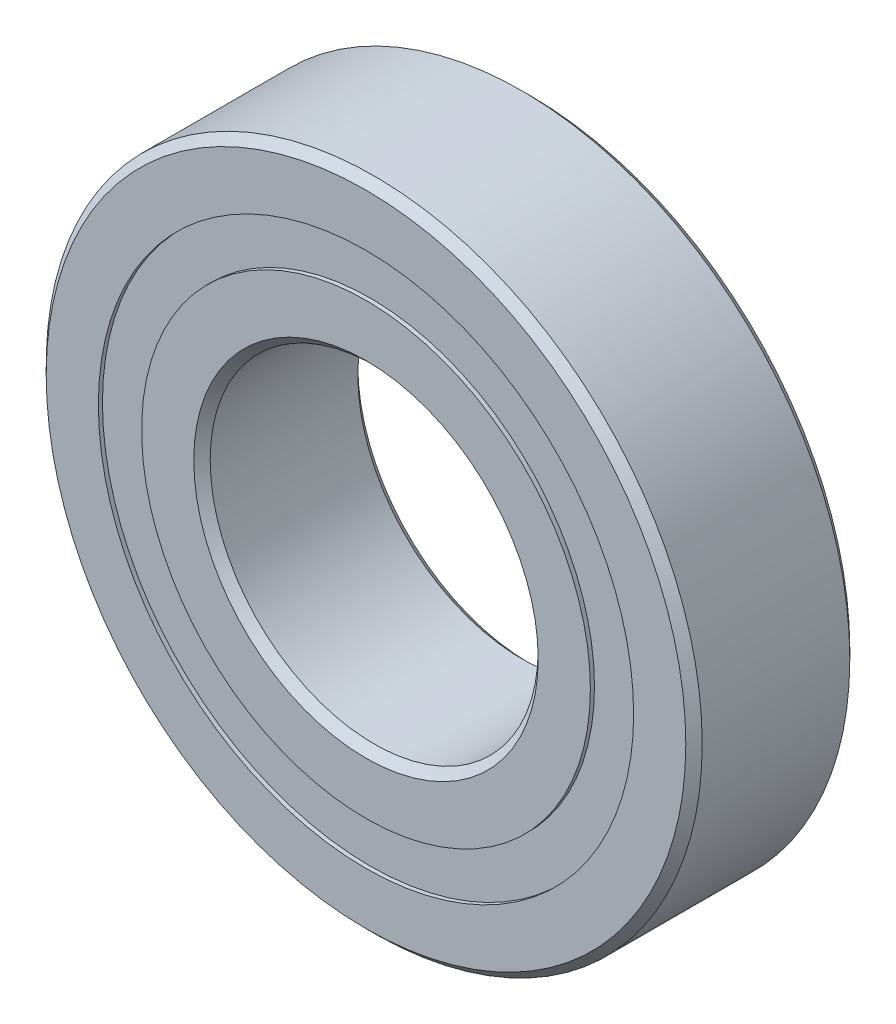
ISO-10303-21;
HEADER;
FILE_DESCRIPTION(('STEP AP214'),'2;1');
FILE_NAME('part.step','',(''),(''),'','','');
FILE_SCHEMA(('AUTOMOTIVE_DESIGN { 1 0 10303 214 1 1 1 1 }'));
ENDSEC;
DATA;
#1=APPLICATION_CONTEXT('core data for automotive mechanical design processes');
#2=APPLICATION_PROTOCOL_DEFINITION('international standard','automotive_design',2000,#1);
#3=PRODUCT_CONTEXT('',#1,'mechanical');
#4=PRODUCT('Part','Part','',(#3));
#5=PRODUCT_RELATED_PRODUCT_CATEGORY('part','',(#4));
#6=PRODUCT_DEFINITION_FORMATION('','',#4);
#7=PRODUCT_DEFINITION_CONTEXT('part definition',#1,'design');
#8=PRODUCT_DEFINITION('design','',#6,#7);
#9=PRODUCT_DEFINITION_SHAPE('','',#8);
#10=(LENGTH_UNIT() NAMED_UNIT(*) SI_UNIT(.MILLI.,.METRE.));
#11=(NAMED_UNIT(*) PLANE_ANGLE_UNIT() SI_UNIT($,.RADIAN.));
#12=(NAMED_UNIT(*) SI_UNIT($,.STERADIAN.) SOLID_ANGLE_UNIT());
#13=UNCERTAINTY_MEASURE_WITH_UNIT(LENGTH_MEASURE(1.E-05),#10,'distance_accuracy_value','');
#14=(GEOMETRIC_REPRESENTATION_CONTEXT(3) GLOBAL_UNCERTAINTY_ASSIGNED_CONTEXT((#13)) GLOBAL_UNIT_ASSIGNED_CONTEXT((#10,
#11,#12)) REPRESENTATION_CONTEXT('',''));
#15=CARTESIAN_POINT('',(0.,0.,0.));
#16=DIRECTION('',(0.,0.,1.));
#17=DIRECTION('',(1.,0.,0.));
#18=AXIS2_PLACEMENT_3D('',#15,#16,#17);
#19=CARTESIAN_POINT('',(0.,20.7247252747253,-6.0325));
#20=DIRECTION('',(0.,0.,1.));
#21=DIRECTION('',(1.,0.,0.));
#22=AXIS2_PLACEMENT_3D('',#19,#20,#21);
#23=PLANE('',#22);
#24=CARTESIAN_POINT('',(0.,0.,-6.0325));
#25=DIRECTION('',(0.,0.,1.));
#26=DIRECTION('',(1.,0.,0.));
#27=AXIS2_PLACEMENT_3D('',#24,#25,#26);
#28=CIRCLE('',#27,20.7247252747253);
#29=CARTESIAN_POINT('',(20.7247252747253,0.,-6.0325));
#30=VERTEX_POINT('',#29);
#31=EDGE_CURVE('E73',#30,#30,#28,.T.);
#32=ORIENTED_EDGE('',*,*,#31,.F.);
#33=EDGE_LOOP('',(#32));
#34=FACE_BOUND('',#33,.T.);
#35=CARTESIAN_POINT('',(0.,0.,-6.0325));
#36=DIRECTION('',(0.,0.,1.));
#37=DIRECTION('',(1.,0.,0.));
#38=AXIS2_PLACEMENT_3D('',#35,#36,#37);
#39=CIRCLE('',#38,17.3752747252747);
#40=CARTESIAN_POINT('',(17.3752747252747,0.,-6.0325));
#41=VERTEX_POINT('',#40);
#42=EDGE_CURVE('E11',#41,#41,#39,.T.);
#43=ORIENTED_EDGE('',*,*,#42,.T.);
#44=EDGE_LOOP('',(#43));
#45=FACE_BOUND('',#44,.T.);
#46=ADVANCED_FACE('F54',(#34,#45),#23,.F.);
#47=CARTESIAN_POINT('',(0.,0.,6.34999999999999));
#48=DIRECTION('',(0.,0.,1.));
#49=DIRECTION('',(1.,0.,0.));
#50=AXIS2_PLACEMENT_3D('',#47,#48,#49);
#51=CYLINDRICAL_SURFACE('',#50,17.3752747252747);
#52=ORIENTED_EDGE('',*,*,#42,.F.);
#53=EDGE_LOOP('',(#52));
#54=FACE_BOUND('',#53,.T.);
#55=CARTESIAN_POINT('',(0.,0.,-3.28171342706955));
#56=DIRECTION('',(0.,0.,1.));
#57=DIRECTION('',(1.,0.,0.));
#58=AXIS2_PLACEMENT_3D('',#55,#56,#57);
#59=CIRCLE('',#58,17.3752747252747);
#60=CARTESIAN_POINT('',(17.3752747252747,0.,-3.28171342706955));
#61=VERTEX_POINT('',#60);
#62=EDGE_CURVE('E61',#61,#61,#59,.T.);
#63=ORIENTED_EDGE('',*,*,#62,.T.);
#64=EDGE_LOOP('',(#63));
#65=FACE_BOUND('',#64,.T.);
#66=ADVANCED_FACE('F84',(#54,#65),#51,.F.);
#67=CARTESIAN_POINT('',(0.,20.7247252747253,-3.28171342706955));
#68=DIRECTION('',(0.,0.,-1.));
#69=DIRECTION('',(-1.,0.,0.));
#70=AXIS2_PLACEMENT_3D('',#67,#68,#69);
#71=PLANE('',#70);
#72=ORIENTED_EDGE('',*,*,#62,.F.);
#73=EDGE_LOOP('',(#72));
#74=FACE_BOUND('',#73,.T.);
#75=CARTESIAN_POINT('',(0.,0.,-3.28171342706955));
#76=DIRECTION('',(0.,0.,1.));
#77=DIRECTION('',(1.,0.,0.));
#78=AXIS2_PLACEMENT_3D('',#75,#76,#77);
#79=CIRCLE('',#78,20.7247252747253);
#80=CARTESIAN_POINT('',(20.7247252747253,0.,-3.28171342706955));
#81=VERTEX_POINT('',#80);
#82=EDGE_CURVE('E67',#81,#81,#79,.T.);
#83=ORIENTED_EDGE('',*,*,#82,.T.);
#84=EDGE_LOOP('',(#83));
#85=FACE_BOUND('',#84,.T.);
#86=ADVANCED_FACE('F88',(#74,#85),#71,.F.);
#87=CARTESIAN_POINT('',(0.,0.,6.34999999999999));
#88=DIRECTION('',(0.,0.,1.));
#89=DIRECTION('',(1.,0.,0.));
#90=AXIS2_PLACEMENT_3D('',#87,#88,#89);
#91=CYLINDRICAL_SURFACE('',#90,20.7247252747253);
#92=ORIENTED_EDGE('',*,*,#82,.F.);
#93=EDGE_LOOP('',(#92));
#94=FACE_BOUND('',#93,.T.);
#95=ORIENTED_EDGE('',*,*,#31,.T.);
#96=EDGE_LOOP('',(#95));
#97=FACE_BOUND('',#96,.T.);
#98=ADVANCED_FACE('F81',(#94,#97),#91,.T.);
#99=CLOSED_SHELL('',(#46,#66,#86,#98));
#100=MANIFOLD_SOLID_BREP('B2',#99);
#101=CARTESIAN_POINT('',(0.,20.7247252747253,6.0325));
#102=DIRECTION('',(0.,0.,-1.));
#103=DIRECTION('',(-1.,0.,0.));
#104=AXIS2_PLACEMENT_3D('',#101,#102,#103);
#105=PLANE('',#104);
#106=CARTESIAN_POINT('',(0.,0.,6.0325));
#107=DIRECTION('',(0.,0.,1.));
#108=DIRECTION('',(1.,0.,0.));
#109=AXIS2_PLACEMENT_3D('',#106,#107,#108);
#110=CIRCLE('',#109,17.3752747252747);
#111=CARTESIAN_POINT('',(17.3752747252747,0.,6.0325));
#112=VERTEX_POINT('',#111);
#113=EDGE_CURVE('E53',#112,#112,#110,.T.);
#114=ORIENTED_EDGE('',*,*,#113,.F.);
#115=EDGE_LOOP('',(#114));
#116=FACE_BOUND('',#115,.T.);
#117=CARTESIAN_POINT('',(0.,0.,6.0325));
#118=DIRECTION('',(0.,0.,1.));
#119=DIRECTION('',(1.,0.,0.));
#120=AXIS2_PLACEMENT_3D('',#117,#118,#119);
#121=CIRCLE('',#120,20.7247252747253);
#122=CARTESIAN_POINT('',(20.7247252747253,0.,6.0325));
#123=VERTEX_POINT('',#122);
#124=EDGE_CURVE('E165',#123,#123,#121,.T.);
#125=ORIENTED_EDGE('',*,*,#124,.T.);
#126=EDGE_LOOP('',(#125));
#127=FACE_BOUND('',#126,.T.);
#128=ADVANCED_FACE('F146',(#116,#127),#105,.F.);
#129=CARTESIAN_POINT('',(0.,0.,6.34999999999999));
#130=DIRECTION('',(0.,0.,1.));
#131=DIRECTION('',(1.,0.,0.));
#132=AXIS2_PLACEMENT_3D('',#129,#130,#131);
#133=CYLINDRICAL_SURFACE('',#132,17.3752747252747);
#134=CARTESIAN_POINT('',(0.,0.,3.28171342706955));
#135=DIRECTION('',(0.,0.,1.));
#136=DIRECTION('',(1.,0.,0.));
#137=AXIS2_PLACEMENT_3D('',#134,#135,#136);
#138=CIRCLE('',#137,17.3752747252747);
#139=CARTESIAN_POINT('',(17.3752747252747,0.,3.28171342706955));
#140=VERTEX_POINT('',#139);
#141=EDGE_CURVE('E153',#140,#140,#138,.T.);
#142=ORIENTED_EDGE('',*,*,#141,.F.);
#143=EDGE_LOOP('',(#142));
#144=FACE_BOUND('',#143,.T.);
#145=ORIENTED_EDGE('',*,*,#113,.T.);
#146=EDGE_LOOP('',(#145));
#147=FACE_BOUND('',#146,.T.);
#148=ADVANCED_FACE('F182',(#144,#147),#133,.F.);
#149=CARTESIAN_POINT('',(0.,20.7247252747253,3.28171342706955));
#150=DIRECTION('',(0.,0.,1.));
#151=DIRECTION('',(1.,0.,0.));
#152=AXIS2_PLACEMENT_3D('',#149,#150,#151);
#153=PLANE('',#152);
#154=CARTESIAN_POINT('',(0.,0.,3.28171342706955));
#155=DIRECTION('',(0.,0.,1.));
#156=DIRECTION('',(1.,0.,0.));
#157=AXIS2_PLACEMENT_3D('',#154,#155,#156);
#158=CIRCLE('',#157,20.7247252747253);
#159=CARTESIAN_POINT('',(20.7247252747253,0.,3.28171342706955));
#160=VERTEX_POINT('',#159);
#161=EDGE_CURVE('E159',#160,#160,#158,.T.);
#162=ORIENTED_EDGE('',*,*,#161,.F.);
#163=EDGE_LOOP('',(#162));
#164=FACE_BOUND('',#163,.T.);
#165=ORIENTED_EDGE('',*,*,#141,.T.);
#166=EDGE_LOOP('',(#165));
#167=FACE_BOUND('',#166,.T.);
#168=ADVANCED_FACE('F177',(#164,#167),#153,.F.);
#169=CARTESIAN_POINT('',(0.,0.,6.34999999999999));
#170=DIRECTION('',(0.,0.,1.));
#171=DIRECTION('',(1.,0.,0.));
#172=AXIS2_PLACEMENT_3D('',#169,#170,#171);
#173=CYLINDRICAL_SURFACE('',#172,20.7247252747253);
#174=ORIENTED_EDGE('',*,*,#124,.F.);
#175=EDGE_LOOP('',(#174));
#176=FACE_BOUND('',#175,.T.);
#177=ORIENTED_EDGE('',*,*,#161,.T.);
#178=EDGE_LOOP('',(#177));
#179=FACE_BOUND('',#178,.T.);
#180=ADVANCED_FACE('F174',(#176,#179),#173,.T.);
#181=CLOSED_SHELL('',(#128,#148,#168,#180));
#182=MANIFOLD_SOLID_BREP('B6',#181);
#183=CARTESIAN_POINT('',(-9.52499999999979,16.4977839420937,0.));
#184=DIRECTION('',(0.,0.,1.));
#185=DIRECTION('',(-0.499999999999987,0.866025403784445,0.));
#186=AXIS2_PLACEMENT_3D('',#183,#184,#185);
#187=SPHERICAL_SURFACE('',#186,3.28171342706955);
#188=CARTESIAN_POINT('',(-9.52499999999979,16.4977839420937,3.28171342706955));
#189=VERTEX_POINT('',#188);
#190=VERTEX_LOOP('',#189);
#191=FACE_BOUND('',#190,.T.);
#192=ADVANCED_FACE('F238',(#191),#187,.T.);
#193=CLOSED_SHELL('',(#192));
#194=MANIFOLD_SOLID_BREP('B48',#193);
#195=CARTESIAN_POINT('',(-16.4977839420934,9.52500000000017,0.));
#196=DIRECTION('',(0.,0.,1.));
#197=DIRECTION('',(-0.866025403784431,0.500000000000009,0.));
#198=AXIS2_PLACEMENT_3D('',#195,#196,#197);
#199=SPHERICAL_SURFACE('',#198,3.28171342706955);
#200=CARTESIAN_POINT('',(-16.4977839420934,9.52500000000017,3.28171342706955));
#201=VERTEX_POINT('',#200);
#202=VERTEX_LOOP('',#201);
#203=FACE_BOUND('',#202,.T.);
#204=ADVANCED_FACE('F263',(#203),#199,.T.);
#205=CLOSED_SHELL('',(#204));
#206=MANIFOLD_SOLID_BREP('B142',#205);
#207=CARTESIAN_POINT('',(-19.05,1.7206288477345E-13,0.));
#208=DIRECTION('',(0.,0.,1.));
#209=DIRECTION('',(-1.,0.,0.));
#210=AXIS2_PLACEMENT_3D('',#207,#208,#209);
#211=SPHERICAL_SURFACE('',#210,3.28171342706955);
#212=CARTESIAN_POINT('',(-19.05,1.7206288477345E-13,3.28171342706955));
#213=VERTEX_POINT('',#212);
#214=VERTEX_LOOP('',#213);
#215=FACE_BOUND('',#214,.T.);
#216=ADVANCED_FACE('F288',(#215),#211,.T.);
#217=CLOSED_SHELL('',(#216));
#218=MANIFOLD_SOLID_BREP('B234',#217);
#219=CARTESIAN_POINT('',(-16.4977839420936,-9.52499999999987,0.));
#220=DIRECTION('',(0.,0.,1.));
#221=DIRECTION('',(-0.866025403784443,-0.499999999999993,0.));
#222=AXIS2_PLACEMENT_3D('',#219,#220,#221);
#223=SPHERICAL_SURFACE('',#222,3.28171342706955);
#224=CARTESIAN_POINT('',(-16.4977839420936,-9.52499999999987,3.28171342706955));
#225=VERTEX_POINT('',#224);
#226=VERTEX_LOOP('',#225);
#227=FACE_BOUND('',#226,.T.);
#228=ADVANCED_FACE('F313',(#227),#223,.T.);
#229=CLOSED_SHELL('',(#228));
#230=MANIFOLD_SOLID_BREP('B259',#229);
#231=CARTESIAN_POINT('',(-9.52500000000013,-16.4977839420935,0.));
#232=DIRECTION('',(0.,0.,1.));
#233=DIRECTION('',(-0.500000000000009,-0.866025403784436,0.));
#234=AXIS2_PLACEMENT_3D('',#231,#232,#233);
#235=SPHERICAL_SURFACE('',#234,3.28171342706955);
#236=CARTESIAN_POINT('',(-9.52500000000013,-16.4977839420935,3.28171342706955));
#237=VERTEX_POINT('',#236);
#238=VERTEX_LOOP('',#237);
#239=FACE_BOUND('',#238,.T.);
#240=ADVANCED_FACE('F338',(#239),#235,.T.);
#241=CLOSED_SHELL('',(#240));
#242=MANIFOLD_SOLID_BREP('B284',#241);
#243=CARTESIAN_POINT('',(-1.56125112837913E-13,-19.05,0.));
#244=DIRECTION('',(0.,0.,1.));
#245=DIRECTION('',(0.,-1.,0.));
#246=AXIS2_PLACEMENT_3D('',#243,#244,#245);
#247=SPHERICAL_SURFACE('',#246,3.28171342706955);
#248=CARTESIAN_POINT('',(-1.56125112837913E-13,-19.05,3.28171342706955));
#249=VERTEX_POINT('',#248);
#250=VERTEX_LOOP('',#249);
#251=FACE_BOUND('',#250,.T.);
#252=ADVANCED_FACE('F363',(#251),#247,.T.);
#253=CLOSED_SHELL('',(#252));
#254=MANIFOLD_SOLID_BREP('B309',#253);
#255=CARTESIAN_POINT('',(9.5249999999999,-16.4977839420936,0.));
#256=DIRECTION('',(0.,0.,1.));
#257=DIRECTION('',(0.499999999999994,-0.866025403784442,0.));
#258=AXIS2_PLACEMENT_3D('',#255,#256,#257);
#259=SPHERICAL_SURFACE('',#258,3.28171342706955);
#260=CARTESIAN_POINT('',(9.5249999999999,-16.4977839420936,3.28171342706955));
#261=VERTEX_POINT('',#260);
#262=VERTEX_LOOP('',#261);
#263=FACE_BOUND('',#262,.T.);
#264=ADVANCED_FACE('F388',(#263),#259,.T.);
#265=CLOSED_SHELL('',(#264));
#266=MANIFOLD_SOLID_BREP('B334',#265);
#267=CARTESIAN_POINT('',(16.4977839420935,-9.52500000000005,0.));
#268=DIRECTION('',(0.,0.,1.));
#269=DIRECTION('',(0.866025403784435,-0.500000000000003,0.));
#270=AXIS2_PLACEMENT_3D('',#267,#268,#269);
#271=SPHERICAL_SURFACE('',#270,3.28171342706955);
#272=CARTESIAN_POINT('',(16.4977839420935,-9.52500000000005,3.28171342706955));
#273=VERTEX_POINT('',#272);
#274=VERTEX_LOOP('',#273);
#275=FACE_BOUND('',#274,.T.);
#276=ADVANCED_FACE('F413',(#275),#271,.T.);
#277=CLOSED_SHELL('',(#276));
#278=MANIFOLD_SOLID_BREP('B359',#277);
#279=CARTESIAN_POINT('',(19.05,0.,0.));
#280=DIRECTION('',(0.,0.,1.));
#281=DIRECTION('',(1.,0.,0.));
#282=AXIS2_PLACEMENT_3D('',#279,#280,#281);
#283=SPHERICAL_SURFACE('',#282,3.28171342706955);
#284=CARTESIAN_POINT('',(19.05,0.,3.28171342706955));
#285=VERTEX_POINT('',#284);
#286=VERTEX_LOOP('',#285);
#287=FACE_BOUND('',#286,.T.);
#288=ADVANCED_FACE('F438',(#287),#283,.T.);
#289=CLOSED_SHELL('',(#288));
#290=MANIFOLD_SOLID_BREP('B384',#289);
#291=CARTESIAN_POINT('',(16.4977839420936,9.52499999999998,0.));
#292=DIRECTION('',(0.,0.,1.));
#293=DIRECTION('',(0.86602540378444,0.499999999999999,0.));
#294=AXIS2_PLACEMENT_3D('',#291,#292,#293);
#295=SPHERICAL_SURFACE('',#294,3.28171342706955);
#296=CARTESIAN_POINT('',(16.4977839420936,9.52499999999998,3.28171342706955));
#297=VERTEX_POINT('',#296);
#298=VERTEX_LOOP('',#297);
#299=FACE_BOUND('',#298,.T.);
#300=ADVANCED_FACE('F463',(#299),#295,.T.);
#301=CLOSED_SHELL('',(#300));
#302=MANIFOLD_SOLID_BREP('B409',#301);
#303=CARTESIAN_POINT('',(9.52500000000002,16.4977839420936,0.));
#304=DIRECTION('',(0.,0.,1.));
#305=DIRECTION('',(0.500000000000002,0.866025403784439,0.));
#306=AXIS2_PLACEMENT_3D('',#303,#304,#305);
#307=SPHERICAL_SURFACE('',#306,3.28171342706955);
#308=CARTESIAN_POINT('',(9.52500000000002,16.4977839420936,3.28171342706955));
#309=VERTEX_POINT('',#308);
#310=VERTEX_LOOP('',#309);
#311=FACE_BOUND('',#310,.T.);
#312=ADVANCED_FACE('F488',(#311),#307,.T.);
#313=CLOSED_SHELL('',(#312));
#314=MANIFOLD_SOLID_BREP('B434',#313);
#315=CARTESIAN_POINT('',(0.,19.05,0.));
#316=DIRECTION('',(0.,0.,1.));
#317=DIRECTION('',(0.,1.,0.));
#318=AXIS2_PLACEMENT_3D('',#315,#316,#317);
#319=SPHERICAL_SURFACE('',#318,3.28171342706955);
#320=CARTESIAN_POINT('',(0.,19.05,3.28171342706955));
#321=VERTEX_POINT('',#320);
#322=VERTEX_LOOP('',#321);
#323=FACE_BOUND('',#322,.T.);
#324=ADVANCED_FACE('F515',(#323),#319,.T.);
#325=CLOSED_SHELL('',(#324));
#326=MANIFOLD_SOLID_BREP('B459',#325);
#327=CARTESIAN_POINT('',(0.,17.3752747252747,6.35000000000001));
#328=DIRECTION('',(0.,0.,-1.));
#329=DIRECTION('',(-1.,0.,0.));
#330=AXIS2_PLACEMENT_3D('',#327,#328,#329);
#331=PLANE('',#330);
#332=CARTESIAN_POINT('',(0.,0.,6.35000000000001));
#333=DIRECTION('',(0.,0.,1.));
#334=DIRECTION('',(1.,0.,0.));
#335=AXIS2_PLACEMENT_3D('',#332,#333,#334);
#336=CIRCLE('',#335,13.335);
#337=CARTESIAN_POINT('',(13.335,0.,6.35000000000001));
#338=VERTEX_POINT('',#337);
#339=EDGE_CURVE('E572',#338,#338,#336,.T.);
#340=ORIENTED_EDGE('',*,*,#339,.F.);
#341=EDGE_LOOP('',(#340));
#342=FACE_BOUND('',#341,.T.);
#343=CARTESIAN_POINT('',(0.,0.,6.35000000000001));
#344=DIRECTION('',(0.,0.,1.));
#345=DIRECTION('',(1.,0.,0.));
#346=AXIS2_PLACEMENT_3D('',#343,#344,#345);
#347=CIRCLE('',#346,17.3752747252747);
#348=CARTESIAN_POINT('',(17.3752747252747,0.,6.35000000000001));
#349=VERTEX_POINT('',#348);
#350=EDGE_CURVE('E514',#349,#349,#347,.T.);
#351=ORIENTED_EDGE('',*,*,#350,.T.);
#352=EDGE_LOOP('',(#351));
#353=FACE_BOUND('',#352,.T.);
#354=ADVANCED_FACE('F535',(#342,#353),#331,.F.);
#355=CARTESIAN_POINT('',(0.,0.,6.34999999999999));
#356=DIRECTION('',(0.,0.,1.));
#357=DIRECTION('',(1.,0.,0.));
#358=AXIS2_PLACEMENT_3D('',#355,#356,#357);
#359=CYLINDRICAL_SURFACE('',#358,17.3752747252747);
#360=ORIENTED_EDGE('',*,*,#350,.F.);
#361=EDGE_LOOP('',(#360));
#362=FACE_BOUND('',#361,.T.);
#363=CARTESIAN_POINT('',(0.,0.,2.82222222222223));
#364=DIRECTION('',(0.,0.,1.));
#365=DIRECTION('',(1.,0.,0.));
#366=AXIS2_PLACEMENT_3D('',#363,#364,#365);
#367=CIRCLE('',#366,17.3752747252747);
#368=CARTESIAN_POINT('',(17.3752747252747,0.,2.82222222222223));
#369=VERTEX_POINT('',#368);
#370=EDGE_CURVE('E542',#369,#369,#367,.T.);
#371=ORIENTED_EDGE('',*,*,#370,.T.);
#372=EDGE_LOOP('',(#371));
#373=FACE_BOUND('',#372,.T.);
#374=ADVANCED_FACE('F581',(#362,#373),#359,.T.);
#375=CARTESIAN_POINT('',(0.,0.,0.));
#376=DIRECTION('',(0.,0.,1.));
#377=DIRECTION('',(1.,0.,0.));
#378=AXIS2_PLACEMENT_3D('',#375,#376,#377);
#379=TOROIDAL_SURFACE('',#378,19.05,3.28171342706954);
#380=ORIENTED_EDGE('',*,*,#370,.F.);
#381=EDGE_LOOP('',(#380));
#382=FACE_BOUND('',#381,.T.);
#383=CARTESIAN_POINT('',(0.,0.,-2.82222222222223));
#384=DIRECTION('',(0.,0.,1.));
#385=DIRECTION('',(1.,0.,0.));
#386=AXIS2_PLACEMENT_3D('',#383,#384,#385);
#387=CIRCLE('',#386,17.3752747252747);
#388=CARTESIAN_POINT('',(17.3752747252747,0.,-2.82222222222223));
#389=VERTEX_POINT('',#388);
#390=EDGE_CURVE('E548',#389,#389,#387,.T.);
#391=ORIENTED_EDGE('',*,*,#390,.T.);
#392=EDGE_LOOP('',(#391));
#393=FACE_BOUND('',#392,.T.);
#394=ADVANCED_FACE('F585',(#382,#393),#379,.F.);
#395=CARTESIAN_POINT('',(0.,0.,6.34999999999999));
#396=DIRECTION('',(0.,0.,1.));
#397=DIRECTION('',(1.,0.,0.));
#398=AXIS2_PLACEMENT_3D('',#395,#396,#397);
#399=CYLINDRICAL_SURFACE('',#398,17.3752747252747);
#400=ORIENTED_EDGE('',*,*,#390,.F.);
#401=EDGE_LOOP('',(#400));
#402=FACE_BOUND('',#401,.T.);
#403=CARTESIAN_POINT('',(0.,0.,-6.35000000000001));
#404=DIRECTION('',(0.,0.,1.));
#405=DIRECTION('',(1.,0.,0.));
#406=AXIS2_PLACEMENT_3D('',#403,#404,#405);
#407=CIRCLE('',#406,17.3752747252747);
#408=CARTESIAN_POINT('',(17.3752747252747,0.,-6.35000000000001));
#409=VERTEX_POINT('',#408);
#410=EDGE_CURVE('E554',#409,#409,#407,.T.);
#411=ORIENTED_EDGE('',*,*,#410,.T.);
#412=EDGE_LOOP('',(#411));
#413=FACE_BOUND('',#412,.T.);
#414=ADVANCED_FACE('F590',(#402,#413),#399,.T.);
#415=CARTESIAN_POINT('',(0.,13.335,-6.34999999999999));
#416=DIRECTION('',(0.,0.,1.));
#417=DIRECTION('',(1.,0.,0.));
#418=AXIS2_PLACEMENT_3D('',#415,#416,#417);
#419=PLANE('',#418);
#420=ORIENTED_EDGE('',*,*,#410,.F.);
#421=EDGE_LOOP('',(#420));
#422=FACE_BOUND('',#421,.T.);
#423=CARTESIAN_POINT('',(0.,0.,-6.34999999999999));
#424=DIRECTION('',(0.,0.,1.));
#425=DIRECTION('',(1.,0.,0.));
#426=AXIS2_PLACEMENT_3D('',#423,#424,#425);
#427=CIRCLE('',#426,13.335);
#428=CARTESIAN_POINT('',(13.335,0.,-6.34999999999999));
#429=VERTEX_POINT('',#428);
#430=EDGE_CURVE('E560',#429,#429,#427,.T.);
#431=ORIENTED_EDGE('',*,*,#430,.T.);
#432=EDGE_LOOP('',(#431));
#433=FACE_BOUND('',#432,.T.);
#434=ADVANCED_FACE('F596',(#422,#433),#419,.F.);
#435=CARTESIAN_POINT('',(0.,0.,-5.715));
#436=DIRECTION('',(0.,0.,-1.));
#437=DIRECTION('',(-1.,0.,0.));
#438=AXIS2_PLACEMENT_3D('',#435,#436,#437);
#439=CONICAL_SURFACE('',#438,12.7,0.785398163397444);
#440=ORIENTED_EDGE('',*,*,#430,.F.);
#441=EDGE_LOOP('',(#440));
#442=FACE_BOUND('',#441,.T.);
#443=CARTESIAN_POINT('',(0.,0.,-5.715));
#444=DIRECTION('',(0.,0.,1.));
#445=DIRECTION('',(1.,0.,0.));
#446=AXIS2_PLACEMENT_3D('',#443,#444,#445);
#447=CIRCLE('',#446,12.7);
#448=CARTESIAN_POINT('',(12.7,0.,-5.715));
#449=VERTEX_POINT('',#448);
#450=EDGE_CURVE('E564',#449,#449,#447,.T.);
#451=ORIENTED_EDGE('',*,*,#450,.T.);
#452=EDGE_LOOP('',(#451));
#453=FACE_BOUND('',#452,.T.);
#454=ADVANCED_FACE('F600',(#442,#453),#439,.F.);
#455=CARTESIAN_POINT('',(0.,0.,6.34999999999999));
#456=DIRECTION('',(0.,0.,1.));
#457=DIRECTION('',(1.,0.,0.));
#458=AXIS2_PLACEMENT_3D('',#455,#456,#457);
#459=CYLINDRICAL_SURFACE('',#458,12.7);
#460=ORIENTED_EDGE('',*,*,#450,.F.);
#461=EDGE_LOOP('',(#460));
#462=FACE_BOUND('',#461,.T.);
#463=CARTESIAN_POINT('',(0.,0.,5.71500000000001));
#464=DIRECTION('',(0.,0.,1.));
#465=DIRECTION('',(1.,0.,0.));
#466=AXIS2_PLACEMENT_3D('',#463,#464,#465);
#467=CIRCLE('',#466,12.7);
#468=CARTESIAN_POINT('',(12.7,0.,5.71500000000001));
#469=VERTEX_POINT('',#468);
#470=EDGE_CURVE('E568',#469,#469,#467,.T.);
#471=ORIENTED_EDGE('',*,*,#470,.T.);
#472=EDGE_LOOP('',(#471));
#473=FACE_BOUND('',#472,.T.);
#474=ADVANCED_FACE('F604',(#462,#473),#459,.F.);
#475=CARTESIAN_POINT('',(0.,0.,6.35000000000001));
#476=DIRECTION('',(0.,0.,1.));
#477=DIRECTION('',(1.,0.,0.));
#478=AXIS2_PLACEMENT_3D('',#475,#476,#477);
#479=CONICAL_SURFACE('',#478,13.335,0.785398163397454);
#480=ORIENTED_EDGE('',*,*,#470,.F.);
#481=EDGE_LOOP('',(#480));
#482=FACE_BOUND('',#481,.T.);
#483=ORIENTED_EDGE('',*,*,#339,.T.);
#484=EDGE_LOOP('',(#483));
#485=FACE_BOUND('',#484,.T.);
#486=ADVANCED_FACE('F578',(#482,#485),#479,.F.);
#487=CLOSED_SHELL('',(#354,#374,#394,#414,#434,#454,#474,#486));
#488=MANIFOLD_SOLID_BREP('B484',#487);
#489=CARTESIAN_POINT('',(0.,0.,5.715));
#490=DIRECTION('',(0.,0.,-1.));
#491=DIRECTION('',(-1.,0.,0.));
#492=AXIS2_PLACEMENT_3D('',#489,#490,#491);
#493=CONICAL_SURFACE('',#492,25.4,0.785398163397444);
#494=CARTESIAN_POINT('',(0.,0.,6.35000000000001));
#495=DIRECTION('',(0.,0.,1.));
#496=DIRECTION('',(1.,0.,0.));
#497=AXIS2_PLACEMENT_3D('',#494,#495,#496);
#498=CIRCLE('',#497,24.765);
#499=CARTESIAN_POINT('',(24.765,0.,6.35000000000001));
#500=VERTEX_POINT('',#499);
#501=EDGE_CURVE('E710',#500,#500,#498,.T.);
#502=ORIENTED_EDGE('',*,*,#501,.F.);
#503=EDGE_LOOP('',(#502));
#504=FACE_BOUND('',#503,.T.);
#505=CARTESIAN_POINT('',(0.,0.,5.715));
#506=DIRECTION('',(0.,0.,1.));
#507=DIRECTION('',(1.,0.,0.));
#508=AXIS2_PLACEMENT_3D('',#505,#506,#507);
#509=CIRCLE('',#508,25.4);
#510=CARTESIAN_POINT('',(25.4,0.,5.715));
#511=VERTEX_POINT('',#510);
#512=EDGE_CURVE('E534',#511,#511,#509,.T.);
#513=ORIENTED_EDGE('',*,*,#512,.T.);
#514=EDGE_LOOP('',(#513));
#515=FACE_BOUND('',#514,.T.);
#516=ADVANCED_FACE('F673',(#504,#515),#493,.T.);
#517=CARTESIAN_POINT('',(0.,0.,6.34999999999999));
#518=DIRECTION('',(0.,0.,1.));
#519=DIRECTION('',(1.,0.,0.));
#520=AXIS2_PLACEMENT_3D('',#517,#518,#519);
#521=CYLINDRICAL_SURFACE('',#520,25.4);
#522=ORIENTED_EDGE('',*,*,#512,.F.);
#523=EDGE_LOOP('',(#522));
#524=FACE_BOUND('',#523,.T.);
#525=CARTESIAN_POINT('',(0.,0.,-5.715));
#526=DIRECTION('',(0.,0.,1.));
#527=DIRECTION('',(1.,0.,0.));
#528=AXIS2_PLACEMENT_3D('',#525,#526,#527);
#529=CIRCLE('',#528,25.4);
#530=CARTESIAN_POINT('',(25.4,0.,-5.715));
#531=VERTEX_POINT('',#530);
#532=EDGE_CURVE('E680',#531,#531,#529,.T.);
#533=ORIENTED_EDGE('',*,*,#532,.T.);
#534=EDGE_LOOP('',(#533));
#535=FACE_BOUND('',#534,.T.);
#536=ADVANCED_FACE('F719',(#524,#535),#521,.T.);
#537=CARTESIAN_POINT('',(0.,0.,-6.34999999999999));
#538=DIRECTION('',(0.,0.,1.));
#539=DIRECTION('',(1.,0.,0.));
#540=AXIS2_PLACEMENT_3D('',#537,#538,#539);
#541=CONICAL_SURFACE('',#540,24.765,0.785398163397444);
#542=ORIENTED_EDGE('',*,*,#532,.F.);
#543=EDGE_LOOP('',(#542));
#544=FACE_BOUND('',#543,.T.);
#545=CARTESIAN_POINT('',(0.,0.,-6.34999999999999));
#546=DIRECTION('',(0.,0.,1.));
#547=DIRECTION('',(1.,0.,0.));
#548=AXIS2_PLACEMENT_3D('',#545,#546,#547);
#549=CIRCLE('',#548,24.765);
#550=CARTESIAN_POINT('',(24.765,0.,-6.34999999999999));
#551=VERTEX_POINT('',#550);
#552=EDGE_CURVE('E686',#551,#551,#549,.T.);
#553=ORIENTED_EDGE('',*,*,#552,.T.);
#554=EDGE_LOOP('',(#553));
#555=FACE_BOUND('',#554,.T.);
#556=ADVANCED_FACE('F723',(#544,#555),#541,.T.);
#557=CARTESIAN_POINT('',(0.,24.765,-6.34999999999999));
#558=DIRECTION('',(0.,0.,1.));
#559=DIRECTION('',(1.,0.,0.));
#560=AXIS2_PLACEMENT_3D('',#557,#558,#559);
#561=PLANE('',#560);
#562=ORIENTED_EDGE('',*,*,#552,.F.);
#563=EDGE_LOOP('',(#562));
#564=FACE_BOUND('',#563,.T.);
#565=CARTESIAN_POINT('',(0.,0.,-6.34999999999999));
#566=DIRECTION('',(0.,0.,1.));
#567=DIRECTION('',(1.,0.,0.));
#568=AXIS2_PLACEMENT_3D('',#565,#566,#567);
#569=CIRCLE('',#568,20.7247252747253);
#570=CARTESIAN_POINT('',(20.7247252747253,0.,-6.34999999999999));
#571=VERTEX_POINT('',#570);
#572=EDGE_CURVE('E692',#571,#571,#569,.T.);
#573=ORIENTED_EDGE('',*,*,#572,.T.);
#574=EDGE_LOOP('',(#573));
#575=FACE_BOUND('',#574,.T.);
#576=ADVANCED_FACE('F728',(#564,#575),#561,.F.);
#577=CARTESIAN_POINT('',(0.,0.,6.34999999999999));
#578=DIRECTION('',(0.,0.,1.));
#579=DIRECTION('',(1.,0.,0.));
#580=AXIS2_PLACEMENT_3D('',#577,#578,#579);
#581=CYLINDRICAL_SURFACE('',#580,20.7247252747253);
#582=ORIENTED_EDGE('',*,*,#572,.F.);
#583=EDGE_LOOP('',(#582));
#584=FACE_BOUND('',#583,.T.);
#585=CARTESIAN_POINT('',(0.,0.,-2.82222222222223));
#586=DIRECTION('',(0.,0.,1.));
#587=DIRECTION('',(1.,0.,0.));
#588=AXIS2_PLACEMENT_3D('',#585,#586,#587);
#589=CIRCLE('',#588,20.7247252747253);
#590=CARTESIAN_POINT('',(20.7247252747253,0.,-2.82222222222223));
#591=VERTEX_POINT('',#590);
#592=EDGE_CURVE('E698',#591,#591,#589,.T.);
#593=ORIENTED_EDGE('',*,*,#592,.T.);
#594=EDGE_LOOP('',(#593));
#595=FACE_BOUND('',#594,.T.);
#596=ADVANCED_FACE('F734',(#584,#595),#581,.F.);
#597=CARTESIAN_POINT('',(0.,0.,0.));
#598=DIRECTION('',(0.,0.,1.));
#599=DIRECTION('',(1.,0.,0.));
#600=AXIS2_PLACEMENT_3D('',#597,#598,#599);
#601=TOROIDAL_SURFACE('',#600,19.05,3.28171342706955);
#602=ORIENTED_EDGE('',*,*,#592,.F.);
#603=EDGE_LOOP('',(#602));
#604=FACE_BOUND('',#603,.T.);
#605=CARTESIAN_POINT('',(0.,0.,2.82222222222223));
#606=DIRECTION('',(0.,0.,1.));
#607=DIRECTION('',(1.,0.,0.));
#608=AXIS2_PLACEMENT_3D('',#605,#606,#607);
#609=CIRCLE('',#608,20.7247252747253);
#610=CARTESIAN_POINT('',(20.7247252747253,0.,2.82222222222223));
#611=VERTEX_POINT('',#610);
#612=EDGE_CURVE('E702',#611,#611,#609,.T.);
#613=ORIENTED_EDGE('',*,*,#612,.T.);
#614=EDGE_LOOP('',(#613));
#615=FACE_BOUND('',#614,.T.);
#616=ADVANCED_FACE('F738',(#604,#615),#601,.F.);
#617=CARTESIAN_POINT('',(0.,0.,6.34999999999999));
#618=DIRECTION('',(0.,0.,1.));
#619=DIRECTION('',(1.,0.,0.));
#620=AXIS2_PLACEMENT_3D('',#617,#618,#619);
#621=CYLINDRICAL_SURFACE('',#620,20.7247252747253);
#622=ORIENTED_EDGE('',*,*,#612,.F.);
#623=EDGE_LOOP('',(#622));
#624=FACE_BOUND('',#623,.T.);
#625=CARTESIAN_POINT('',(0.,0.,6.34999999999999));
#626=DIRECTION('',(0.,0.,1.));
#627=DIRECTION('',(1.,0.,0.));
#628=AXIS2_PLACEMENT_3D('',#625,#626,#627);
#629=CIRCLE('',#628,20.7247252747253);
#630=CARTESIAN_POINT('',(20.7247252747253,0.,6.34999999999999));
#631=VERTEX_POINT('',#630);
#632=EDGE_CURVE('E706',#631,#631,#629,.T.);
#633=ORIENTED_EDGE('',*,*,#632,.T.);
#634=EDGE_LOOP('',(#633));
#635=FACE_BOUND('',#634,.T.);
#636=ADVANCED_FACE('F742',(#624,#635),#621,.F.);
#637=CARTESIAN_POINT('',(0.,24.765,6.35000000000001));
#638=DIRECTION('',(0.,0.,-1.));
#639=DIRECTION('',(-1.,0.,0.));
#640=AXIS2_PLACEMENT_3D('',#637,#638,#639);
#641=PLANE('',#640);
#642=ORIENTED_EDGE('',*,*,#632,.F.);
#643=EDGE_LOOP('',(#642));
#644=FACE_BOUND('',#643,.T.);
#645=ORIENTED_EDGE('',*,*,#501,.T.);
#646=EDGE_LOOP('',(#645));
#647=FACE_BOUND('',#646,.T.);
#648=ADVANCED_FACE('F716',(#644,#647),#641,.F.);
#649=CLOSED_SHELL('',(#516,#536,#556,#576,#596,#616,#636,#648));
#650=MANIFOLD_SOLID_BREP('B509',#649);
#651=ADVANCED_BREP_SHAPE_REPRESENTATION('',(#18,#100,#182,#194,#206,#218,#230,#242,#254,#266,
#278,#290,#302,#314,#326,#488,#650),#14);
#652=SHAPE_DEFINITION_REPRESENTATION(#9,#651);
ENDSEC;
END-ISO-10303-21;
